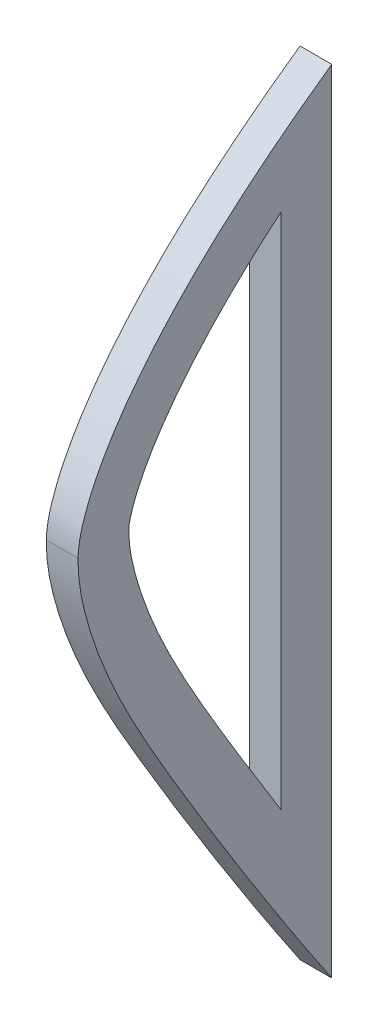
ISO-10303-21;
HEADER;
FILE_DESCRIPTION(('STEP AP214'),'2;1');
FILE_NAME('part.step','',(''),(''),'','','');
FILE_SCHEMA(('AUTOMOTIVE_DESIGN { 1 0 10303 214 1 1 1 1 }'));
ENDSEC;
DATA;
#1=APPLICATION_CONTEXT('core data for automotive mechanical design processes');
#2=APPLICATION_PROTOCOL_DEFINITION('international standard','automotive_design',2000,#1);
#3=PRODUCT_CONTEXT('',#1,'mechanical');
#4=PRODUCT('Part','Part','',(#3));
#5=PRODUCT_RELATED_PRODUCT_CATEGORY('part','',(#4));
#6=PRODUCT_DEFINITION_FORMATION('','',#4);
#7=PRODUCT_DEFINITION_CONTEXT('part definition',#1,'design');
#8=PRODUCT_DEFINITION('design','',#6,#7);
#9=PRODUCT_DEFINITION_SHAPE('','',#8);
#10=(LENGTH_UNIT() NAMED_UNIT(*) SI_UNIT(.MILLI.,.METRE.));
#11=(NAMED_UNIT(*) PLANE_ANGLE_UNIT() SI_UNIT($,.RADIAN.));
#12=(NAMED_UNIT(*) SI_UNIT($,.STERADIAN.) SOLID_ANGLE_UNIT());
#13=UNCERTAINTY_MEASURE_WITH_UNIT(LENGTH_MEASURE(1.E-05),#10,'distance_accuracy_value','');
#14=(GEOMETRIC_REPRESENTATION_CONTEXT(3) GLOBAL_UNCERTAINTY_ASSIGNED_CONTEXT((#13)) GLOBAL_UNIT_ASSIGNED_CONTEXT((#10,
#11,#12)) REPRESENTATION_CONTEXT('',''));
#15=CARTESIAN_POINT('',(0.,0.,0.));
#16=DIRECTION('',(0.,0.,1.));
#17=DIRECTION('',(1.,0.,0.));
#18=AXIS2_PLACEMENT_3D('',#15,#16,#17);
#19=CARTESIAN_POINT('',(266.7,17.1550440566679,-21.7111777394068));
#20=DIRECTION('',(-1.,0.,0.));
#21=DIRECTION('',(0.,0.,1.));
#22=AXIS2_PLACEMENT_3D('',#19,#20,#21);
#23=PLANE('',#22);
#24=CARTESIAN_POINT('',(266.7,-0.0730545536181482,-16.7787285327278));
#25=CARTESIAN_POINT('',(266.7,-0.0243133429287242,-16.7818443769859));
#26=CARTESIAN_POINT('',(266.7,0.0821185359300885,-16.7893140294171));
#27=CARTESIAN_POINT('',(266.7,0.187625247660998,-16.7996558748281));
#28=CARTESIAN_POINT('',(266.7,0.23126192856431,-16.8047990424698));
#29=CARTESIAN_POINT('',(266.7,0.365169271380441,-16.8251616947615));
#30=CARTESIAN_POINT('',(266.7,0.539679559115893,-16.8589784673746));
#31=CARTESIAN_POINT('',(266.7,0.906678412602496,-16.9458816919116));
#32=CARTESIAN_POINT('',(266.7,1.39646673448249,-17.0883297660985));
#33=CARTESIAN_POINT('',(266.7,2.26135146262785,-17.3919131043655));
#34=CARTESIAN_POINT('',(266.7,3.3760859395352,-17.871083734944));
#35=CARTESIAN_POINT('',(266.7,4.74290692864874,-18.5717736510682));
#36=CARTESIAN_POINT('',(266.7,6.08889054029867,-19.3650573826332));
#37=CARTESIAN_POINT('',(266.7,7.87699252066733,-20.545484057571));
#38=CARTESIAN_POINT('',(266.7,10.1109995243572,-22.2364165845036));
#39=CARTESIAN_POINT('',(266.7,12.6874404863996,-24.4502714048126));
#40=CARTESIAN_POINT('',(266.7,15.9860563855376,-27.6221738376924));
#41=CARTESIAN_POINT('',(266.7,18.3334059483878,-30.2345204854226));
#42=CARTESIAN_POINT('',(266.7,19.8235832729133,-32.0138444343023));
#43=B_SPLINE_CURVE_WITH_KNOTS('',3,(#24,#25,#26,#27,#28,#29,#30,#31,#32,#33,#34,#35,#36,#37,#38,
#39,#40,#41,#42),.UNSPECIFIED.,.F.,.F.,(4,1,1,1,1,1,1,1,1,1,1,1,1,1,1,1,4),(0.667332007637951,
0.669246934279545,0.671161860921139,0.673076787562734,0.674991714204328,0.678821567487517,
0.682651420770706,0.690311127337083,0.697970833903461,0.713290247036216,0.728609660168971,
0.743929073301726,0.759248486434481,0.789887312699992,0.820526138965502,0.851164965231012,
0.912442617762033),.UNSPECIFIED.);
#44=CARTESIAN_POINT('',(266.7,-0.0730545536181692,-16.7787285327278));
#45=VERTEX_POINT('',#44);
#46=CARTESIAN_POINT('',(266.7,19.8235832729133,-32.0138444343023));
#47=VERTEX_POINT('',#46);
#48=EDGE_CURVE('E75',#45,#47,#43,.T.);
#49=ORIENTED_EDGE('',*,*,#48,.F.);
#50=CARTESIAN_POINT('',(266.7,-31.9866378036031,-32.0138444343023));
#51=CARTESIAN_POINT('',(266.7,-29.3102141974624,-30.3389003834072));
#52=CARTESIAN_POINT('',(266.7,-25.2745418470817,-27.8682771928051));
#53=CARTESIAN_POINT('',(266.7,-19.8390961116895,-24.630869165528));
#54=CARTESIAN_POINT('',(266.7,-15.818130966105,-22.3275131953071));
#55=CARTESIAN_POINT('',(266.7,-11.8097881379348,-20.2499667046643));
#56=CARTESIAN_POINT('',(266.7,-8.43086455071358,-18.7816841251526));
#57=CARTESIAN_POINT('',(266.7,-6.08255987313416,-17.9570659973817));
#58=CARTESIAN_POINT('',(266.7,-4.75718976588407,-17.5550634404167));
#59=CARTESIAN_POINT('',(266.7,-3.76497446565079,-17.288872778198));
#60=CARTESIAN_POINT('',(266.7,-2.79050595814765,-17.0623614869925));
#61=CARTESIAN_POINT('',(266.7,-1.90559616841693,-16.9034988803895));
#62=CARTESIAN_POINT('',(266.7,-1.26258650978339,-16.8341381682289));
#63=CARTESIAN_POINT('',(266.7,-0.640608250541471,-16.7992038427441));
#64=CARTESIAN_POINT('',(266.7,-0.256148096630284,-16.7849540324195));
#65=CARTESIAN_POINT('',(266.7,-0.0730545536181692,-16.7787285327278));
#66=B_SPLINE_CURVE_WITH_KNOTS('',3,(#50,#51,#52,#53,#54,#55,#56,#57,#58,#59,#60,#61,#62,#63,#64,
#65),.UNSPECIFIED.,.F.,.F.,(4,1,1,1,1,1,1,1,1,1,1,1,1,4),(0.112467877016181,0.175004063713208,
0.206272157061722,0.237540250410236,0.26880834375875,0.300076437107264,0.315710483781521,
0.323527507118649,0.331344530455777,0.339161553792906,0.346978577130034,0.354795600467163,
0.358704112135727,0.362612623804291),.UNSPECIFIED.);
#67=CARTESIAN_POINT('',(266.7,-31.9866378036031,-32.0138444343023));
#68=VERTEX_POINT('',#67);
#69=EDGE_CURVE('E116',#68,#45,#66,.T.);
#70=ORIENTED_EDGE('',*,*,#69,.F.);
#71=DIRECTION('',(0.,-1.,0.));
#72=VECTOR('',#71,1.);
#73=CARTESIAN_POINT('',(266.7,19.8235832729133,-32.0138444343023));
#74=LINE('',#73,#72);
#75=EDGE_CURVE('E123',#47,#68,#74,.T.);
#76=ORIENTED_EDGE('',*,*,#75,.F.);
#77=EDGE_LOOP('',(#49,#70,#76));
#78=FACE_BOUND('',#77,.T.);
#79=CARTESIAN_POINT('',(266.7,30.0870624642814,-37.0938444343023));
#80=CARTESIAN_POINT('',(266.7,28.1454008343164,-34.3173801180677));
#81=CARTESIAN_POINT('',(266.7,26.1014643969461,-31.6149536300884));
#82=CARTESIAN_POINT('',(266.7,23.1291623410317,-28.0436616357155));
#83=CARTESIAN_POINT('',(266.7,22.3112430438248,-27.0948428546296));
#84=CARTESIAN_POINT('',(266.7,20.6326253486949,-25.2281735415512));
#85=CARTESIAN_POINT('',(266.7,19.7704544452485,-24.3088427249066));
#86=CARTESIAN_POINT('',(266.7,17.11865092103,-21.6177283475601));
#87=CARTESIAN_POINT('',(266.7,15.2683582572525,-19.9166902661782));
#88=CARTESIAN_POINT('',(266.7,12.3328666491365,-17.5457973421006));
#89=CARTESIAN_POINT('',(266.7,11.3258173228699,-16.7820646683398));
#90=CARTESIAN_POINT('',(266.7,9.25581140919993,-15.3515138891227));
#91=CARTESIAN_POINT('',(266.7,8.19310852621689,-14.6850770239856));
#92=CARTESIAN_POINT('',(266.7,6.54323022963923,-13.7838465528678));
#93=CARTESIAN_POINT('',(266.7,5.98399688060614,-13.4997875013202));
#94=CARTESIAN_POINT('',(266.7,4.84403111493703,-12.9695750133384));
#95=CARTESIAN_POINT('',(266.7,4.26136374937689,-12.7231514916175));
#96=CARTESIAN_POINT('',(266.7,3.07311367521716,-12.2871759089717));
#97=CARTESIAN_POINT('',(266.7,2.47252512569561,-12.0975812717373));
#98=CARTESIAN_POINT('',(266.7,1.55662677189518,-11.8791500836823));
#99=CARTESIAN_POINT('',(266.7,1.24872791014653,-11.8177584731957));
#100=CARTESIAN_POINT('',(266.7,0.62472519507243,-11.7310184396108));
#101=CARTESIAN_POINT('',(266.7,0.307390104255682,-11.7110786416417));
#102=CARTESIAN_POINT('',(266.7,-0.0105608962498945,-11.6938444343024));
#103=B_SPLINE_CURVE_WITH_KNOTS('',3,(#79,#80,#81,#82,#83,#84,#85,#86,#87,#88,#89,#90,#91,#92,
#93,#94,#95,#96,#97,#98,#99,#100,#101,#102),.UNSPECIFIED.,.F.,.F.,(4,2,2,2,2,2,2,2,2,2,2,4),
(0.665187521685165,0.750000000000001,0.781250000000001,0.812500000000001,0.875,0.90625,0.9375,
0.953125,0.96875,0.984375,0.9921875,1.),.UNSPECIFIED.);
#104=CARTESIAN_POINT('',(266.7,30.0870624642814,-37.0938444343023));
#105=VERTEX_POINT('',#104);
#106=CARTESIAN_POINT('',(266.7,-0.010560896249888,-11.6938444343024));
#107=VERTEX_POINT('',#106);
#108=EDGE_CURVE('E241',#105,#107,#103,.T.);
#109=ORIENTED_EDGE('',*,*,#108,.F.);
#110=DIRECTION('',(0.,1.,0.));
#111=VECTOR('',#110,1.);
#112=CARTESIAN_POINT('',(266.7,-49.1113826403716,-37.0938444343025));
#113=LINE('',#112,#111);
#114=CARTESIAN_POINT('',(266.7,-49.1113826403716,-37.0938444343025));
#115=VERTEX_POINT('',#114);
#116=EDGE_CURVE('E244',#115,#105,#113,.T.);
#117=ORIENTED_EDGE('',*,*,#116,.F.);
#118=CARTESIAN_POINT('',(266.7,-0.010560896249888,-11.6938444343024));
#119=CARTESIAN_POINT('',(266.7,-0.417075556597357,-11.7071831378256));
#120=CARTESIAN_POINT('',(266.7,-0.823524050120347,-11.7207876846385));
#121=CARTESIAN_POINT('',(266.7,-1.63124191821569,-11.7688053033711));
#122=CARTESIAN_POINT('',(266.7,-2.03207720516662,-11.8049624408829));
#123=CARTESIAN_POINT('',(266.7,-3.22240022598028,-11.9623817411191));
#124=CARTESIAN_POINT('',(266.7,-4.00187974562571,-12.1238546382889));
#125=CARTESIAN_POINT('',(266.7,-6.3206736346721,-12.6872011571836));
#126=CARTESIAN_POINT('',(266.7,-7.8394833557402,-13.1714578045993));
#127=CARTESIAN_POINT('',(266.7,-10.8393873507102,-14.2915032107118));
#128=CARTESIAN_POINT('',(266.7,-12.3226232457407,-14.9298456670771));
#129=CARTESIAN_POINT('',(266.7,-15.2185631800582,-16.2977234353837));
#130=CARTESIAN_POINT('',(266.7,-16.6380205054446,-17.0290773235023));
#131=CARTESIAN_POINT('',(266.7,-19.4418031198501,-18.5502078042008));
#132=CARTESIAN_POINT('',(266.7,-20.8260796302414,-19.3400655130395));
#133=CARTESIAN_POINT('',(266.7,-23.5784137799604,-20.9467520490693));
#134=CARTESIAN_POINT('',(266.7,-24.94760740152,-21.7616917983398));
#135=CARTESIAN_POINT('',(266.7,-29.0470078064747,-24.2201147147757));
#136=CARTESIAN_POINT('',(266.7,-31.7648333664048,-25.8841871968273));
#137=CARTESIAN_POINT('',(266.7,-37.1699594107694,-29.2630937349444));
#138=CARTESIAN_POINT('',(266.7,-39.8572365734869,-30.9779665737828));
#139=CARTESIAN_POINT('',(266.7,-44.7352397677807,-34.156898119514));
#140=CARTESIAN_POINT('',(266.7,-46.9307395266917,-35.6130183722182));
#141=CARTESIAN_POINT('',(266.7,-49.1113826403716,-37.0938444343023));
#142=B_SPLINE_CURVE_WITH_KNOTS('',3,(#118,#119,#120,#121,#122,#123,#124,#125,#126,#127,#128,
#129,#130,#131,#132,#133,#134,#135,#136,#137,#138,#139,#140,#141),.UNSPECIFIED.,.F.,.F.,(4,2,2,
2,2,2,2,2,2,2,2,4),(0.,0.00781250000000002,0.015625,0.0312500000000001,0.0625000000000001,
0.0937500000000002,0.125,0.15625,0.1875,0.25,0.312500000000001,0.364119002841702),.UNSPECIFIED.);
#143=EDGE_CURVE('E249',#107,#115,#142,.T.);
#144=ORIENTED_EDGE('',*,*,#143,.F.);
#145=EDGE_LOOP('',(#109,#117,#144));
#146=FACE_BOUND('',#145,.T.);
#147=ADVANCED_FACE('F58',(#78,#146),#23,.T.);
#148=CARTESIAN_POINT('',(269.875,-25.6001148234237,-22.1536142025607));
#149=DIRECTION('',(-1.,0.,0.));
#150=DIRECTION('',(0.,0.,1.));
#151=AXIS2_PLACEMENT_3D('',#148,#149,#150);
#152=PLANE('',#151);
#153=CARTESIAN_POINT('',(269.875,-31.9866378036031,-32.0138444343023));
#154=CARTESIAN_POINT('',(269.875,-29.3102141974624,-30.3389003834072));
#155=CARTESIAN_POINT('',(269.875,-25.2745418470817,-27.8682771928051));
#156=CARTESIAN_POINT('',(269.875,-19.8390961116895,-24.630869165528));
#157=CARTESIAN_POINT('',(269.875,-15.818130966105,-22.3275131953071));
#158=CARTESIAN_POINT('',(269.875,-11.8097881379348,-20.2499667046643));
#159=CARTESIAN_POINT('',(269.875,-8.43086455071358,-18.7816841251526));
#160=CARTESIAN_POINT('',(269.875,-6.08255987313416,-17.9570659973817));
#161=CARTESIAN_POINT('',(269.875,-4.75718976588407,-17.5550634404167));
#162=CARTESIAN_POINT('',(269.875,-3.76497446565079,-17.288872778198));
#163=CARTESIAN_POINT('',(269.875,-2.79050595814765,-17.0623614869925));
#164=CARTESIAN_POINT('',(269.875,-1.90559616841693,-16.9034988803895));
#165=CARTESIAN_POINT('',(269.875,-1.26258650978339,-16.8341381682289));
#166=CARTESIAN_POINT('',(269.875,-0.640608250541471,-16.7992038427441));
#167=CARTESIAN_POINT('',(269.875,-0.256148096630284,-16.7849540324195));
#168=CARTESIAN_POINT('',(269.875,-0.0730545536181692,-16.7787285327278));
#169=B_SPLINE_CURVE_WITH_KNOTS('',3,(#153,#154,#155,#156,#157,#158,#159,#160,#161,#162,#163,
#164,#165,#166,#167,#168),.UNSPECIFIED.,.F.,.F.,(4,1,1,1,1,1,1,1,1,1,1,1,1,4),
(0.112467877016181,0.175004063713208,0.206272157061722,0.237540250410236,0.26880834375875,
0.300076437107264,0.315710483781521,0.323527507118649,0.331344530455777,0.339161553792906,
0.346978577130034,0.354795600467163,0.358704112135727,0.362612623804291),.UNSPECIFIED.);
#170=CARTESIAN_POINT('',(269.875,-31.9866378036031,-32.0138444343023));
#171=VERTEX_POINT('',#170);
#172=CARTESIAN_POINT('',(269.875,-0.0730545536181692,-16.7787285327278));
#173=VERTEX_POINT('',#172);
#174=EDGE_CURVE('E68',#171,#173,#169,.T.);
#175=ORIENTED_EDGE('',*,*,#174,.T.);
#176=CARTESIAN_POINT('',(269.875,-0.0730545536181482,-16.7787285327278));
#177=CARTESIAN_POINT('',(269.875,-0.0243133429287242,-16.7818443769859));
#178=CARTESIAN_POINT('',(269.875,0.0821185359300885,-16.7893140294171));
#179=CARTESIAN_POINT('',(269.875,0.187625247660998,-16.7996558748281));
#180=CARTESIAN_POINT('',(269.875,0.23126192856431,-16.8047990424698));
#181=CARTESIAN_POINT('',(269.875,0.365169271380441,-16.8251616947615));
#182=CARTESIAN_POINT('',(269.875,0.539679559115893,-16.8589784673746));
#183=CARTESIAN_POINT('',(269.875,0.906678412602496,-16.9458816919116));
#184=CARTESIAN_POINT('',(269.875,1.39646673448249,-17.0883297660985));
#185=CARTESIAN_POINT('',(269.875,2.26135146262785,-17.3919131043655));
#186=CARTESIAN_POINT('',(269.875,3.3760859395352,-17.871083734944));
#187=CARTESIAN_POINT('',(269.875,4.74290692864874,-18.5717736510682));
#188=CARTESIAN_POINT('',(269.875,6.08889054029867,-19.3650573826332));
#189=CARTESIAN_POINT('',(269.875,7.87699252066733,-20.545484057571));
#190=CARTESIAN_POINT('',(269.875,10.1109995243572,-22.2364165845036));
#191=CARTESIAN_POINT('',(269.875,12.6874404863996,-24.4502714048126));
#192=CARTESIAN_POINT('',(269.875,15.9860563855376,-27.6221738376924));
#193=CARTESIAN_POINT('',(269.875,18.3334059483878,-30.2345204854226));
#194=CARTESIAN_POINT('',(269.875,19.8235832729133,-32.0138444343023));
#195=B_SPLINE_CURVE_WITH_KNOTS('',3,(#176,#177,#178,#179,#180,#181,#182,#183,#184,#185,#186,
#187,#188,#189,#190,#191,#192,#193,#194),.UNSPECIFIED.,.F.,.F.,(4,1,1,1,1,1,1,1,1,1,1,1,1,1,1,1,
4),(0.667332007637951,0.669246934279545,0.671161860921139,0.673076787562734,0.674991714204328,
0.678821567487517,0.682651420770706,0.690311127337083,0.697970833903461,0.713290247036216,
0.728609660168971,0.743929073301726,0.759248486434481,0.789887312699992,0.820526138965502,
0.851164965231012,0.912442617762033),.UNSPECIFIED.);
#196=CARTESIAN_POINT('',(269.875,19.8235832729133,-32.0138444343023));
#197=VERTEX_POINT('',#196);
#198=EDGE_CURVE('E12',#173,#197,#195,.T.);
#199=ORIENTED_EDGE('',*,*,#198,.T.);
#200=DIRECTION('',(0.,-1.,0.));
#201=VECTOR('',#200,1.);
#202=CARTESIAN_POINT('',(269.875,-25.6001148234237,-32.0138444343023));
#203=LINE('',#202,#201);
#204=EDGE_CURVE('E248',#197,#171,#203,.T.);
#205=ORIENTED_EDGE('',*,*,#204,.T.);
#206=EDGE_LOOP('',(#175,#199,#205));
#207=FACE_BOUND('',#206,.T.);
#208=CARTESIAN_POINT('',(269.875,-0.010560896249888,-11.6938444343024));
#209=CARTESIAN_POINT('',(269.875,-0.417075556597357,-11.7071831378256));
#210=CARTESIAN_POINT('',(269.875,-0.823524050120347,-11.7207876846385));
#211=CARTESIAN_POINT('',(269.875,-1.63124191821569,-11.7688053033711));
#212=CARTESIAN_POINT('',(269.875,-2.03207720516662,-11.8049624408829));
#213=CARTESIAN_POINT('',(269.875,-3.22240022598028,-11.9623817411191));
#214=CARTESIAN_POINT('',(269.875,-4.00187974562571,-12.1238546382889));
#215=CARTESIAN_POINT('',(269.875,-6.3206736346721,-12.6872011571836));
#216=CARTESIAN_POINT('',(269.875,-7.8394833557402,-13.1714578045993));
#217=CARTESIAN_POINT('',(269.875,-10.8393873507102,-14.2915032107118));
#218=CARTESIAN_POINT('',(269.875,-12.3226232457407,-14.9298456670771));
#219=CARTESIAN_POINT('',(269.875,-15.2185631800582,-16.2977234353837));
#220=CARTESIAN_POINT('',(269.875,-16.6380205054446,-17.0290773235023));
#221=CARTESIAN_POINT('',(269.875,-19.4418031198501,-18.5502078042008));
#222=CARTESIAN_POINT('',(269.875,-20.8260796302414,-19.3400655130395));
#223=CARTESIAN_POINT('',(269.875,-23.5784137799604,-20.9467520490693));
#224=CARTESIAN_POINT('',(269.875,-24.94760740152,-21.7616917983398));
#225=CARTESIAN_POINT('',(269.875,-29.0470078064747,-24.2201147147757));
#226=CARTESIAN_POINT('',(269.875,-31.7648333664048,-25.8841871968273));
#227=CARTESIAN_POINT('',(269.875,-37.1699594107694,-29.2630937349444));
#228=CARTESIAN_POINT('',(269.875,-39.8572365734869,-30.9779665737828));
#229=CARTESIAN_POINT('',(269.875,-44.7352397677807,-34.156898119514));
#230=CARTESIAN_POINT('',(269.875,-46.9307395266917,-35.6130183722182));
#231=CARTESIAN_POINT('',(269.875,-49.1113826403716,-37.0938444343023));
#232=B_SPLINE_CURVE_WITH_KNOTS('',3,(#208,#209,#210,#211,#212,#213,#214,#215,#216,#217,#218,
#219,#220,#221,#222,#223,#224,#225,#226,#227,#228,#229,#230,#231),.UNSPECIFIED.,.F.,.F.,(4,2,2,
2,2,2,2,2,2,2,2,4),(0.,0.00781250000000002,0.015625,0.0312500000000001,0.0625000000000001,
0.0937500000000002,0.125,0.15625,0.1875,0.25,0.312500000000001,0.364119002841702),.UNSPECIFIED.);
#233=CARTESIAN_POINT('',(269.875,-0.0105608962498945,-11.6938444343024));
#234=VERTEX_POINT('',#233);
#235=CARTESIAN_POINT('',(269.875,-49.1113826403716,-37.0938444343023));
#236=VERTEX_POINT('',#235);
#237=EDGE_CURVE('E137',#234,#236,#232,.T.);
#238=ORIENTED_EDGE('',*,*,#237,.T.);
#239=DIRECTION('',(0.,1.,0.));
#240=VECTOR('',#239,1.);
#241=CARTESIAN_POINT('',(269.875,30.0870624642814,-37.0938444343023));
#242=LINE('',#241,#240);
#243=CARTESIAN_POINT('',(269.875,30.0870624642814,-37.0938444343023));
#244=VERTEX_POINT('',#243);
#245=EDGE_CURVE('E200',#236,#244,#242,.T.);
#246=ORIENTED_EDGE('',*,*,#245,.T.);
#247=CARTESIAN_POINT('',(269.875,30.0870624642814,-37.0938444343023));
#248=CARTESIAN_POINT('',(269.875,28.1454008343164,-34.3173801180677));
#249=CARTESIAN_POINT('',(269.875,26.1014643969461,-31.6149536300884));
#250=CARTESIAN_POINT('',(269.875,23.1291623410317,-28.0436616357155));
#251=CARTESIAN_POINT('',(269.875,22.3112430438248,-27.0948428546296));
#252=CARTESIAN_POINT('',(269.875,20.6326253486949,-25.2281735415512));
#253=CARTESIAN_POINT('',(269.875,19.7704544452485,-24.3088427249066));
#254=CARTESIAN_POINT('',(269.875,17.11865092103,-21.6177283475601));
#255=CARTESIAN_POINT('',(269.875,15.2683582572525,-19.9166902661782));
#256=CARTESIAN_POINT('',(269.875,12.3328666491365,-17.5457973421006));
#257=CARTESIAN_POINT('',(269.875,11.3258173228699,-16.7820646683398));
#258=CARTESIAN_POINT('',(269.875,9.25581140919993,-15.3515138891227));
#259=CARTESIAN_POINT('',(269.875,8.19310852621689,-14.6850770239856));
#260=CARTESIAN_POINT('',(269.875,6.54323022963923,-13.7838465528678));
#261=CARTESIAN_POINT('',(269.875,5.98399688060614,-13.4997875013202));
#262=CARTESIAN_POINT('',(269.875,4.84403111493703,-12.9695750133384));
#263=CARTESIAN_POINT('',(269.875,4.26136374937689,-12.7231514916175));
#264=CARTESIAN_POINT('',(269.875,3.07311367521716,-12.2871759089717));
#265=CARTESIAN_POINT('',(269.875,2.47252512569561,-12.0975812717373));
#266=CARTESIAN_POINT('',(269.875,1.55662677189518,-11.8791500836823));
#267=CARTESIAN_POINT('',(269.875,1.24872791014653,-11.8177584731957));
#268=CARTESIAN_POINT('',(269.875,0.62472519507243,-11.7310184396108));
#269=CARTESIAN_POINT('',(269.875,0.307390104255682,-11.7110786416417));
#270=CARTESIAN_POINT('',(269.875,-0.0105608962498945,-11.6938444343024));
#271=B_SPLINE_CURVE_WITH_KNOTS('',3,(#247,#248,#249,#250,#251,#252,#253,#254,#255,#256,#257,
#258,#259,#260,#261,#262,#263,#264,#265,#266,#267,#268,#269,#270),.UNSPECIFIED.,.F.,.F.,(4,2,2,
2,2,2,2,2,2,2,2,4),(0.665187521685165,0.750000000000001,0.781250000000001,0.812500000000001,
0.875,0.90625,0.9375,0.953125,0.96875,0.984375,0.9921875,1.),.UNSPECIFIED.);
#272=EDGE_CURVE('E143',#244,#234,#271,.T.);
#273=ORIENTED_EDGE('',*,*,#272,.T.);
#274=EDGE_LOOP('',(#238,#246,#273));
#275=FACE_BOUND('',#274,.T.);
#276=ADVANCED_FACE('F212',(#207,#275),#152,.F.);
#277=CARTESIAN_POINT('',(269.875,-49.1113826403716,-37.0938444343023));
#278=CARTESIAN_POINT('',(266.7,-49.1113826403716,-37.0938444343023));
#279=CARTESIAN_POINT('',(269.875,-40.7793212065529,-31.4357275032546));
#280=CARTESIAN_POINT('',(266.7,-40.7793212065529,-31.4357275032546));
#281=CARTESIAN_POINT('',(269.874999999999,-32.2450085629206,-26.0775852603284));
#282=CARTESIAN_POINT('',(266.699999999999,-32.2450085629206,-26.0775852603284));
#283=CARTESIAN_POINT('',(269.875,-19.5428495652228,-18.5649828461338));
#284=CARTESIAN_POINT('',(266.700000000001,-19.5428495652228,-18.5649828461338));
#285=CARTESIAN_POINT('',(269.874999999996,-13.2476395662756,-14.9795778587285));
#286=CARTESIAN_POINT('',(266.699999999996,-13.2476395662756,-14.9795778587285));
#287=CARTESIAN_POINT('',(269.875,-6.39373317892733,-12.6462695517257));
#288=CARTESIAN_POINT('',(266.700000000001,-6.39373317892733,-12.6462695517257));
#289=CARTESIAN_POINT('',(269.875,-2.9681761768156,-11.9128033245711));
#290=CARTESIAN_POINT('',(266.699999999999,-2.9681761768156,-11.9128033245711));
#291=CARTESIAN_POINT('',(269.875000000001,-1.66214356097984,-11.7429362221974));
#292=CARTESIAN_POINT('',(266.7,-1.66214356097984,-11.7429362221974));
#293=CARTESIAN_POINT('',(269.875,-0.348871335940955,-11.7049451966955));
#294=CARTESIAN_POINT('',(266.7,-0.348871335940955,-11.7049451966955));
#295=CARTESIAN_POINT('',(269.875,-0.010560896249888,-11.6938444343024));
#296=CARTESIAN_POINT('',(266.7,-0.010560896249888,-11.6938444343024));
#297=B_SPLINE_SURFACE_WITH_KNOTS('',3,1,((#277,#278),(#279,#280),(#281,#282),(#283,#284),(#285,
#286),(#287,#288),(#289,#290),(#291,#292),(#293,#294),(#295,#296)),.UNSPECIFIED.,.F.,.F.,.F.,(4,
2,1,2,1,4),(2,2),(0.,0.541512090208998,0.793461403808215,0.929379389415431,0.981800559916444,
1.),(0.,1.),.UNSPECIFIED.);
#298=DIRECTION('',(-1.,0.,0.));
#299=VECTOR('',#298,1.);
#300=CARTESIAN_POINT('',(268.2875,-0.010560896249888,-11.6938444343024));
#301=LINE('',#300,#299);
#302=EDGE_CURVE('E149',#234,#107,#301,.T.);
#303=DIRECTION('',(1.,0.,0.));
#304=VECTOR('',#303,1.);
#305=CARTESIAN_POINT('',(268.2875,-49.1113826403716,-37.0938444343023));
#306=LINE('',#305,#304);
#307=EDGE_CURVE('E199',#115,#236,#306,.T.);
#308=ORIENTED_EDGE('',*,*,#237,.F.);
#309=ORIENTED_EDGE('',*,*,#302,.T.);
#310=ORIENTED_EDGE('',*,*,#143,.T.);
#311=ORIENTED_EDGE('',*,*,#307,.T.);
#312=EDGE_LOOP('',(#308,#309,#310,#311));
#313=FACE_BOUND('',#312,.T.);
#314=ADVANCED_FACE('F163',(#313),#297,.T.);
#315=CARTESIAN_POINT('',(269.875,-0.0105608962498945,-11.6938444343024));
#316=CARTESIAN_POINT('',(266.7,-0.0105608962498945,-11.6938444343024));
#317=CARTESIAN_POINT('',(269.875,0.891515655088624,-11.7427405670303));
#318=CARTESIAN_POINT('',(266.7,0.891515655088624,-11.7427405670303));
#319=CARTESIAN_POINT('',(269.875,1.7879584045666,-11.8874541618424));
#320=CARTESIAN_POINT('',(266.7,1.7879584045666,-11.8874541618424));
#321=CARTESIAN_POINT('',(269.875,3.59533728321276,-12.4621522651465));
#322=CARTESIAN_POINT('',(266.7,3.59533728321276,-12.4621522651465));
#323=CARTESIAN_POINT('',(269.875,4.51842549743396,-12.8124697227894));
#324=CARTESIAN_POINT('',(266.7,4.51842549743396,-12.8124697227894));
#325=CARTESIAN_POINT('',(269.874999999999,7.88092936665613,-14.3909755239418));
#326=CARTESIAN_POINT('',(266.7,7.88092936665613,-14.3909755239418));
#327=CARTESIAN_POINT('',(269.875,12.0617171742335,-17.1444109629733));
#328=CARTESIAN_POINT('',(266.7,12.0617171742335,-17.1444109629733));
#329=CARTESIAN_POINT('',(269.875,18.160672975446,-22.4693834785794));
#330=CARTESIAN_POINT('',(266.699999999999,18.160672975446,-22.4693834785794));
#331=CARTESIAN_POINT('',(269.875,24.1249350513135,-29.005351147867));
#332=CARTESIAN_POINT('',(266.7,24.1249350513135,-29.005351147867));
#333=CARTESIAN_POINT('',(269.875,28.0966477503154,-34.2476660154939));
#334=CARTESIAN_POINT('',(266.7,28.0966477503154,-34.2476660154939));
#335=CARTESIAN_POINT('',(269.875,30.0870624642814,-37.0938444343023));
#336=CARTESIAN_POINT('',(266.7,30.0870624642814,-37.0938444343023));
#337=B_SPLINE_SURFACE_WITH_KNOTS('',3,1,((#315,#316),(#317,#318),(#319,#320),(#321,#322),(#323,
#324),(#325,#326),(#327,#328),(#329,#330),(#331,#332),(#333,#334),(#335,#336)),.UNSPECIFIED.,
.F.,.F.,.F.,(4,2,2,1,1,1,4),(2,2),(0.,0.0671723560228048,0.140685497921882,0.343078035424992,
0.511354005114295,0.741766979512566,1.),(0.,1.),.UNSPECIFIED.);
#338=DIRECTION('',(-1.,0.,0.));
#339=VECTOR('',#338,1.);
#340=CARTESIAN_POINT('',(268.2875,30.0870624642814,-37.0938444343023));
#341=LINE('',#340,#339);
#342=EDGE_CURVE('E362',#244,#105,#341,.T.);
#343=ORIENTED_EDGE('',*,*,#272,.F.);
#344=ORIENTED_EDGE('',*,*,#342,.T.);
#345=ORIENTED_EDGE('',*,*,#108,.T.);
#346=ORIENTED_EDGE('',*,*,#302,.F.);
#347=EDGE_LOOP('',(#343,#344,#345,#346));
#348=FACE_BOUND('',#347,.T.);
#349=ADVANCED_FACE('F151',(#348),#337,.T.);
#350=CARTESIAN_POINT('',(0.,0.,-37.0938444343024));
#351=DIRECTION('',(0.,0.,-1.));
#352=DIRECTION('',(0.,1.,0.));
#353=AXIS2_PLACEMENT_3D('',#350,#351,#352);
#354=PLANE('',#353);
#355=ORIENTED_EDGE('',*,*,#307,.F.);
#356=ORIENTED_EDGE('',*,*,#116,.T.);
#357=ORIENTED_EDGE('',*,*,#342,.F.);
#358=ORIENTED_EDGE('',*,*,#245,.F.);
#359=EDGE_LOOP('',(#355,#356,#357,#358));
#360=FACE_BOUND('',#359,.T.);
#361=ADVANCED_FACE('F162',(#360),#354,.T.);
#362=CARTESIAN_POINT('',(269.972575169003,-0.0730545536181482,-16.7787285327278));
#363=CARTESIAN_POINT('',(269.972575169003,-0.0243133429287242,-16.7818443769859));
#364=CARTESIAN_POINT('',(269.972575169003,0.0821185359300885,-16.7893140294171));
#365=CARTESIAN_POINT('',(269.972575169003,0.187625247660998,-16.7996558748281));
#366=CARTESIAN_POINT('',(269.972575169003,0.23126192856431,-16.8047990424698));
#367=CARTESIAN_POINT('',(269.972575169003,0.365169271380441,-16.8251616947615));
#368=CARTESIAN_POINT('',(269.972575169003,0.539679559115893,-16.8589784673746));
#369=CARTESIAN_POINT('',(269.972575169003,0.906678412602496,-16.9458816919116));
#370=CARTESIAN_POINT('',(269.972575169003,1.39646673448249,-17.0883297660985));
#371=CARTESIAN_POINT('',(269.972575169003,2.26135146262785,-17.3919131043655));
#372=CARTESIAN_POINT('',(269.972575169003,3.3760859395352,-17.871083734944));
#373=CARTESIAN_POINT('',(269.972575169003,4.74290692864874,-18.5717736510682));
#374=CARTESIAN_POINT('',(269.972575169003,6.08889054029867,-19.3650573826332));
#375=CARTESIAN_POINT('',(269.972575169003,7.87699252066733,-20.545484057571));
#376=CARTESIAN_POINT('',(269.972575169003,10.1109995243572,-22.2364165845036));
#377=CARTESIAN_POINT('',(269.972575169003,12.6874404863996,-24.4502714048126));
#378=CARTESIAN_POINT('',(269.972575169003,15.9860563855376,-27.6221738376924));
#379=CARTESIAN_POINT('',(269.972575169003,18.3334059483878,-30.2345204854226));
#380=CARTESIAN_POINT('',(269.972575169003,19.8235832729133,-32.0138444343023));
#381=B_SPLINE_CURVE_WITH_KNOTS('',3,(#362,#363,#364,#365,#366,#367,#368,#369,#370,#371,#372,
#373,#374,#375,#376,#377,#378,#379,#380),.UNSPECIFIED.,.F.,.F.,(4,1,1,1,1,1,1,1,1,1,1,1,1,1,1,1,
4),(0.667332007637951,0.669246934279545,0.671161860921139,0.673076787562734,0.674991714204328,
0.678821567487517,0.682651420770706,0.690311127337083,0.697970833903461,0.713290247036216,
0.728609660168971,0.743929073301726,0.759248486434481,0.789887312699992,0.820526138965502,
0.851164965231012,0.912442617762033),.UNSPECIFIED.);
#382=DIRECTION('',(-1.,0.,0.));
#383=VECTOR('',#382,1.);
#384=SURFACE_OF_LINEAR_EXTRUSION('',#381,#383);
#385=DIRECTION('',(-1.,0.,0.));
#386=VECTOR('',#385,1.);
#387=CARTESIAN_POINT('',(269.972575169003,-0.0730545536181692,-16.7787285327278));
#388=LINE('',#387,#386);
#389=EDGE_CURVE('E119',#173,#45,#388,.T.);
#390=ORIENTED_EDGE('',*,*,#389,.T.);
#391=ORIENTED_EDGE('',*,*,#48,.T.);
#392=DIRECTION('',(-1.,0.,0.));
#393=VECTOR('',#392,1.);
#394=CARTESIAN_POINT('',(269.972575169003,19.8235832729133,-32.0138444343023));
#395=LINE('',#394,#393);
#396=EDGE_CURVE('E120',#197,#47,#395,.T.);
#397=ORIENTED_EDGE('',*,*,#396,.F.);
#398=ORIENTED_EDGE('',*,*,#198,.F.);
#399=EDGE_LOOP('',(#390,#391,#397,#398));
#400=FACE_BOUND('',#399,.T.);
#401=ADVANCED_FACE('F222',(#400),#384,.F.);
#402=CARTESIAN_POINT('',(269.972575169003,-31.9866378036031,-32.0138444343023));
#403=CARTESIAN_POINT('',(269.972575169003,-29.3102141974624,-30.3389003834072));
#404=CARTESIAN_POINT('',(269.972575169003,-25.2745418470817,-27.8682771928051));
#405=CARTESIAN_POINT('',(269.972575169003,-19.8390961116895,-24.630869165528));
#406=CARTESIAN_POINT('',(269.972575169003,-15.818130966105,-22.3275131953071));
#407=CARTESIAN_POINT('',(269.972575169003,-11.8097881379348,-20.2499667046643));
#408=CARTESIAN_POINT('',(269.972575169003,-8.43086455071358,-18.7816841251526));
#409=CARTESIAN_POINT('',(269.972575169003,-6.08255987313416,-17.9570659973817));
#410=CARTESIAN_POINT('',(269.972575169003,-4.75718976588407,-17.5550634404167));
#411=CARTESIAN_POINT('',(269.972575169003,-3.76497446565079,-17.288872778198));
#412=CARTESIAN_POINT('',(269.972575169003,-2.79050595814765,-17.0623614869925));
#413=CARTESIAN_POINT('',(269.972575169003,-1.90559616841693,-16.9034988803895));
#414=CARTESIAN_POINT('',(269.972575169003,-1.26258650978339,-16.8341381682289));
#415=CARTESIAN_POINT('',(269.972575169003,-0.640608250541471,-16.7992038427441));
#416=CARTESIAN_POINT('',(269.972575169003,-0.256148096630284,-16.7849540324195));
#417=CARTESIAN_POINT('',(269.972575169003,-0.0730545536181692,-16.7787285327278));
#418=B_SPLINE_CURVE_WITH_KNOTS('',3,(#402,#403,#404,#405,#406,#407,#408,#409,#410,#411,#412,
#413,#414,#415,#416,#417),.UNSPECIFIED.,.F.,.F.,(4,1,1,1,1,1,1,1,1,1,1,1,1,4),
(0.112467877016181,0.175004063713208,0.206272157061722,0.237540250410236,0.26880834375875,
0.300076437107264,0.315710483781521,0.323527507118649,0.331344530455777,0.339161553792906,
0.346978577130034,0.354795600467163,0.358704112135727,0.362612623804291),.UNSPECIFIED.);
#419=DIRECTION('',(-1.,0.,0.));
#420=VECTOR('',#419,1.);
#421=SURFACE_OF_LINEAR_EXTRUSION('',#418,#420);
#422=DIRECTION('',(-1.,0.,0.));
#423=VECTOR('',#422,1.);
#424=CARTESIAN_POINT('',(269.972575169003,-31.9866378036031,-32.0138444343023));
#425=LINE('',#424,#423);
#426=EDGE_CURVE('E83',#171,#68,#425,.T.);
#427=ORIENTED_EDGE('',*,*,#426,.T.);
#428=ORIENTED_EDGE('',*,*,#69,.T.);
#429=ORIENTED_EDGE('',*,*,#389,.F.);
#430=ORIENTED_EDGE('',*,*,#174,.F.);
#431=EDGE_LOOP('',(#427,#428,#429,#430));
#432=FACE_BOUND('',#431,.T.);
#433=ADVANCED_FACE('F113',(#432),#421,.F.);
#434=CARTESIAN_POINT('',(269.972575169003,19.8235832729133,-32.0138444343023));
#435=DIRECTION('',(0.,0.,-1.));
#436=DIRECTION('',(-1.,0.,0.));
#437=AXIS2_PLACEMENT_3D('',#434,#435,#436);
#438=PLANE('',#437);
#439=ORIENTED_EDGE('',*,*,#396,.T.);
#440=ORIENTED_EDGE('',*,*,#75,.T.);
#441=ORIENTED_EDGE('',*,*,#426,.F.);
#442=ORIENTED_EDGE('',*,*,#204,.F.);
#443=EDGE_LOOP('',(#439,#440,#441,#442));
#444=FACE_BOUND('',#443,.T.);
#445=ADVANCED_FACE('F124',(#444),#438,.F.);
#446=CLOSED_SHELL('',(#147,#276,#314,#349,#361,#401,#433,#445));
#447=MANIFOLD_SOLID_BREP('B2',#446);
#448=ADVANCED_BREP_SHAPE_REPRESENTATION('',(#18,#447),#14);
#449=SHAPE_DEFINITION_REPRESENTATION(#9,#448);
ENDSEC;
END-ISO-10303-21;
